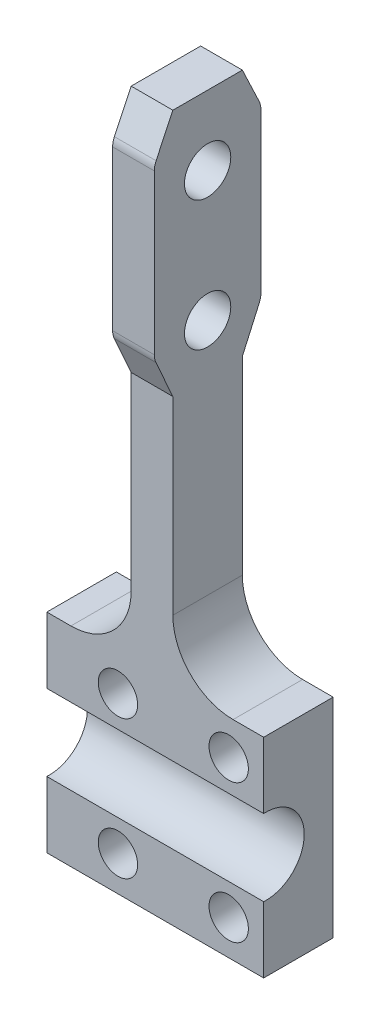
ISO-10303-21;
HEADER;
FILE_DESCRIPTION(('STEP AP214'),'2;1');
FILE_NAME('part.step','',(''),(''),'','','');
FILE_SCHEMA(('AUTOMOTIVE_DESIGN { 1 0 10303 214 1 1 1 1 }'));
ENDSEC;
DATA;
#1=APPLICATION_CONTEXT('core data for automotive mechanical design processes');
#2=APPLICATION_PROTOCOL_DEFINITION('international standard','automotive_design',2000,#1);
#3=PRODUCT_CONTEXT('',#1,'mechanical');
#4=PRODUCT('Part','Part','',(#3));
#5=PRODUCT_RELATED_PRODUCT_CATEGORY('part','',(#4));
#6=PRODUCT_DEFINITION_FORMATION('','',#4);
#7=PRODUCT_DEFINITION_CONTEXT('part definition',#1,'design');
#8=PRODUCT_DEFINITION('design','',#6,#7);
#9=PRODUCT_DEFINITION_SHAPE('','',#8);
#10=(LENGTH_UNIT() NAMED_UNIT(*) SI_UNIT(.MILLI.,.METRE.));
#11=(NAMED_UNIT(*) PLANE_ANGLE_UNIT() SI_UNIT($,.RADIAN.));
#12=(NAMED_UNIT(*) SI_UNIT($,.STERADIAN.) SOLID_ANGLE_UNIT());
#13=UNCERTAINTY_MEASURE_WITH_UNIT(LENGTH_MEASURE(1.E-05),#10,'distance_accuracy_value','');
#14=(GEOMETRIC_REPRESENTATION_CONTEXT(3) GLOBAL_UNCERTAINTY_ASSIGNED_CONTEXT((#13)) GLOBAL_UNIT_ASSIGNED_CONTEXT((#10,
#11,#12)) REPRESENTATION_CONTEXT('',''));
#15=CARTESIAN_POINT('',(0.,0.,0.));
#16=DIRECTION('',(0.,0.,1.));
#17=DIRECTION('',(1.,0.,0.));
#18=AXIS2_PLACEMENT_3D('',#15,#16,#17);
#19=CARTESIAN_POINT('',(13.9,35.5,0.));
#20=DIRECTION('',(0.,0.,1.));
#21=DIRECTION('',(1.,0.,0.));
#22=AXIS2_PLACEMENT_3D('',#19,#20,#21);
#23=PLANE('',#22);
#24=CARTESIAN_POINT('',(-10.95,14.95,0.));
#25=DIRECTION('',(0.,0.,1.));
#26=DIRECTION('',(1.,0.,0.));
#27=AXIS2_PLACEMENT_3D('',#24,#25,#26);
#28=CIRCLE('',#27,4.25);
#29=CARTESIAN_POINT('',(-6.7,14.95,0.));
#30=VERTEX_POINT('',#29);
#31=EDGE_CURVE('E276',#30,#30,#28,.T.);
#32=ORIENTED_EDGE('',*,*,#31,.T.);
#33=EDGE_LOOP('',(#32));
#34=FACE_BOUND('',#33,.T.);
#35=CARTESIAN_POINT('',(12.95,14.95,0.));
#36=DIRECTION('',(0.,0.,1.));
#37=DIRECTION('',(1.,0.,0.));
#38=AXIS2_PLACEMENT_3D('',#35,#36,#37);
#39=CIRCLE('',#38,4.25);
#40=CARTESIAN_POINT('',(17.2,14.95,0.));
#41=VERTEX_POINT('',#40);
#42=EDGE_CURVE('E280',#41,#41,#39,.T.);
#43=ORIENTED_EDGE('',*,*,#42,.T.);
#44=EDGE_LOOP('',(#43));
#45=FACE_BOUND('',#44,.T.);
#46=CARTESIAN_POINT('',(12.95,-14.95,0.));
#47=DIRECTION('',(0.,0.,1.));
#48=DIRECTION('',(1.,0.,0.));
#49=AXIS2_PLACEMENT_3D('',#46,#47,#48);
#50=CIRCLE('',#49,4.25);
#51=CARTESIAN_POINT('',(17.2,-14.95,0.));
#52=VERTEX_POINT('',#51);
#53=EDGE_CURVE('E286',#52,#52,#50,.T.);
#54=ORIENTED_EDGE('',*,*,#53,.T.);
#55=EDGE_LOOP('',(#54));
#56=FACE_BOUND('',#55,.T.);
#57=CARTESIAN_POINT('',(-10.95,-14.95,0.));
#58=DIRECTION('',(0.,0.,1.));
#59=DIRECTION('',(1.,0.,0.));
#60=AXIS2_PLACEMENT_3D('',#57,#58,#59);
#61=CIRCLE('',#60,4.25);
#62=CARTESIAN_POINT('',(-6.7,-14.95,0.));
#63=VERTEX_POINT('',#62);
#64=EDGE_CURVE('E292',#63,#63,#61,.T.);
#65=ORIENTED_EDGE('',*,*,#64,.T.);
#66=EDGE_LOOP('',(#65));
#67=FACE_BOUND('',#66,.T.);
#68=DIRECTION('',(-1.,0.,0.));
#69=VECTOR('',#68,1.);
#70=CARTESIAN_POINT('',(54.5624362774462,76.3868514547035,0.));
#71=LINE('',#70,#69);
#72=CARTESIAN_POINT('',(0.900000000000005,76.3868514547035,0.));
#73=VERTEX_POINT('',#72);
#74=CARTESIAN_POINT('',(-8.09999999999999,76.3868514547035,0.));
#75=VERTEX_POINT('',#74);
#76=EDGE_CURVE('E191',#73,#75,#71,.T.);
#77=ORIENTED_EDGE('',*,*,#76,.F.);
#78=DIRECTION('',(0.,1.,0.));
#79=VECTOR('',#78,1.);
#80=CARTESIAN_POINT('',(0.900000000000005,35.5000000000001,0.));
#81=LINE('',#80,#79);
#82=CARTESIAN_POINT('',(0.900000000000005,35.5000000000001,0.));
#83=VERTEX_POINT('',#82);
#84=EDGE_CURVE('E335',#83,#73,#81,.T.);
#85=ORIENTED_EDGE('',*,*,#84,.F.);
#86=CARTESIAN_POINT('',(13.9,35.5,0.));
#87=DIRECTION('',(0.,0.,-1.));
#88=DIRECTION('',(1.,0.,0.));
#89=AXIS2_PLACEMENT_3D('',#86,#87,#88);
#90=CIRCLE('',#89,13.);
#91=CARTESIAN_POINT('',(13.9000000000001,22.5,0.));
#92=VERTEX_POINT('',#91);
#93=EDGE_CURVE('E333',#92,#83,#90,.T.);
#94=ORIENTED_EDGE('',*,*,#93,.F.);
#95=DIRECTION('',(-1.,0.,0.));
#96=VECTOR('',#95,1.);
#97=CARTESIAN_POINT('',(20.5,22.5,0.));
#98=LINE('',#97,#96);
#99=CARTESIAN_POINT('',(20.5,22.5,0.));
#100=VERTEX_POINT('',#99);
#101=EDGE_CURVE('E331',#100,#92,#98,.T.);
#102=ORIENTED_EDGE('',*,*,#101,.F.);
#103=DIRECTION('',(0.,1.,0.));
#104=VECTOR('',#103,1.);
#105=CARTESIAN_POINT('',(20.5,-22.5,0.));
#106=LINE('',#105,#104);
#107=CARTESIAN_POINT('',(20.5,-22.5,0.));
#108=VERTEX_POINT('',#107);
#109=EDGE_CURVE('E329',#108,#100,#106,.T.);
#110=ORIENTED_EDGE('',*,*,#109,.F.);
#111=DIRECTION('',(1.,0.,0.));
#112=VECTOR('',#111,1.);
#113=CARTESIAN_POINT('',(-26.3,-22.5,0.));
#114=LINE('',#113,#112);
#115=CARTESIAN_POINT('',(-26.3,-22.5,0.));
#116=VERTEX_POINT('',#115);
#117=EDGE_CURVE('E298',#116,#108,#114,.T.);
#118=ORIENTED_EDGE('',*,*,#117,.F.);
#119=DIRECTION('',(0.,-1.,0.));
#120=VECTOR('',#119,1.);
#121=CARTESIAN_POINT('',(-26.3,22.5,0.));
#122=LINE('',#121,#120);
#123=CARTESIAN_POINT('',(-26.3,22.5,0.));
#124=VERTEX_POINT('',#123);
#125=EDGE_CURVE('E305',#124,#116,#122,.T.);
#126=ORIENTED_EDGE('',*,*,#125,.F.);
#127=DIRECTION('',(-1.,0.,0.));
#128=VECTOR('',#127,1.);
#129=CARTESIAN_POINT('',(-8.09999999999999,22.5,0.));
#130=LINE('',#129,#128);
#131=CARTESIAN_POINT('',(-21.1,22.5,0.));
#132=VERTEX_POINT('',#131);
#133=EDGE_CURVE('E342',#132,#124,#130,.T.);
#134=ORIENTED_EDGE('',*,*,#133,.F.);
#135=CARTESIAN_POINT('',(-21.1,35.5,0.));
#136=DIRECTION('',(0.,0.,1.));
#137=DIRECTION('',(1.,0.,0.));
#138=AXIS2_PLACEMENT_3D('',#135,#136,#137);
#139=CIRCLE('',#138,13.);
#140=CARTESIAN_POINT('',(-8.09999999999999,35.5,0.));
#141=VERTEX_POINT('',#140);
#142=EDGE_CURVE('E41',#132,#141,#139,.T.);
#143=ORIENTED_EDGE('',*,*,#142,.T.);
#144=DIRECTION('',(0.,-1.,0.));
#145=VECTOR('',#144,1.);
#146=CARTESIAN_POINT('',(-8.09999999999999,22.5,0.));
#147=LINE('',#146,#145);
#148=EDGE_CURVE('E340',#75,#141,#147,.T.);
#149=ORIENTED_EDGE('',*,*,#148,.F.);
#150=EDGE_LOOP('',(#77,#85,#94,#102,#110,#118,#126,#134,#143,#149));
#151=FACE_BOUND('',#150,.T.);
#152=ADVANCED_FACE('F33',(#34,#45,#56,#67,#151),#23,.F.);
#153=CARTESIAN_POINT('',(13.9,35.5,15.));
#154=DIRECTION('',(0.,0.,1.));
#155=DIRECTION('',(1.,0.,0.));
#156=AXIS2_PLACEMENT_3D('',#153,#154,#155);
#157=PLANE('',#156);
#158=DIRECTION('',(-1.,0.,0.));
#159=VECTOR('',#158,1.);
#160=CARTESIAN_POINT('',(54.5624362774462,76.3868514547035,15.));
#161=LINE('',#160,#159);
#162=CARTESIAN_POINT('',(0.900000000000005,76.3868514547035,15.));
#163=VERTEX_POINT('',#162);
#164=CARTESIAN_POINT('',(-8.09999999999999,76.3868514547035,15.));
#165=VERTEX_POINT('',#164);
#166=EDGE_CURVE('E247',#163,#165,#161,.T.);
#167=ORIENTED_EDGE('',*,*,#166,.T.);
#168=DIRECTION('',(0.,-1.,0.));
#169=VECTOR('',#168,1.);
#170=CARTESIAN_POINT('',(-8.09999999999999,22.5,15.));
#171=LINE('',#170,#169);
#172=CARTESIAN_POINT('',(-8.09999999999999,35.5,15.));
#173=VERTEX_POINT('',#172);
#174=EDGE_CURVE('E318',#165,#173,#171,.T.);
#175=ORIENTED_EDGE('',*,*,#174,.T.);
#176=CARTESIAN_POINT('',(-21.1,35.5,15.));
#177=DIRECTION('',(0.,0.,1.));
#178=DIRECTION('',(1.,0.,0.));
#179=AXIS2_PLACEMENT_3D('',#176,#177,#178);
#180=CIRCLE('',#179,13.);
#181=CARTESIAN_POINT('',(-21.1,22.5,15.));
#182=VERTEX_POINT('',#181);
#183=EDGE_CURVE('E11',#173,#182,#180,.F.);
#184=ORIENTED_EDGE('',*,*,#183,.T.);
#185=DIRECTION('',(-1.,0.,0.));
#186=VECTOR('',#185,1.);
#187=CARTESIAN_POINT('',(-8.09999999999999,22.5,15.));
#188=LINE('',#187,#186);
#189=CARTESIAN_POINT('',(-26.3,22.5,15.));
#190=VERTEX_POINT('',#189);
#191=EDGE_CURVE('E320',#182,#190,#188,.T.);
#192=ORIENTED_EDGE('',*,*,#191,.T.);
#193=DIRECTION('',(0.,-1.,0.));
#194=VECTOR('',#193,1.);
#195=CARTESIAN_POINT('',(-26.3,22.5,15.));
#196=LINE('',#195,#194);
#197=CARTESIAN_POINT('',(-26.3,8.2348345460003,15.));
#198=VERTEX_POINT('',#197);
#199=EDGE_CURVE('E323',#190,#198,#196,.T.);
#200=ORIENTED_EDGE('',*,*,#199,.T.);
#201=DIRECTION('',(-1.,0.,0.));
#202=VECTOR('',#201,1.);
#203=CARTESIAN_POINT('',(28.75,8.2348345460003,15.));
#204=LINE('',#203,#202);
#205=CARTESIAN_POINT('',(20.5,8.2348345460003,15.));
#206=VERTEX_POINT('',#205);
#207=EDGE_CURVE('E274',#206,#198,#204,.T.);
#208=ORIENTED_EDGE('',*,*,#207,.F.);
#209=DIRECTION('',(0.,1.,0.));
#210=VECTOR('',#209,1.);
#211=CARTESIAN_POINT('',(20.5,-22.5,15.));
#212=LINE('',#211,#210);
#213=CARTESIAN_POINT('',(20.5,22.5,15.));
#214=VERTEX_POINT('',#213);
#215=EDGE_CURVE('E304',#206,#214,#212,.T.);
#216=ORIENTED_EDGE('',*,*,#215,.T.);
#217=DIRECTION('',(-1.,0.,0.));
#218=VECTOR('',#217,1.);
#219=CARTESIAN_POINT('',(20.5,22.5,15.));
#220=LINE('',#219,#218);
#221=CARTESIAN_POINT('',(13.9000000000001,22.5,15.));
#222=VERTEX_POINT('',#221);
#223=EDGE_CURVE('E309',#214,#222,#220,.T.);
#224=ORIENTED_EDGE('',*,*,#223,.T.);
#225=CARTESIAN_POINT('',(13.9,35.5,15.));
#226=DIRECTION('',(0.,0.,-1.));
#227=DIRECTION('',(1.,0.,0.));
#228=AXIS2_PLACEMENT_3D('',#225,#226,#227);
#229=CIRCLE('',#228,13.);
#230=CARTESIAN_POINT('',(0.900000000000005,35.5000000000001,15.));
#231=VERTEX_POINT('',#230);
#232=EDGE_CURVE('E311',#222,#231,#229,.T.);
#233=ORIENTED_EDGE('',*,*,#232,.T.);
#234=DIRECTION('',(0.,1.,0.));
#235=VECTOR('',#234,1.);
#236=CARTESIAN_POINT('',(0.900000000000005,35.5000000000001,15.));
#237=LINE('',#236,#235);
#238=EDGE_CURVE('E313',#231,#163,#237,.T.);
#239=ORIENTED_EDGE('',*,*,#238,.T.);
#240=EDGE_LOOP('',(#167,#175,#184,#192,#200,#208,#216,#224,#233,#239));
#241=FACE_BOUND('',#240,.T.);
#242=CARTESIAN_POINT('',(-10.95,14.95,15.));
#243=DIRECTION('',(0.,0.,1.));
#244=DIRECTION('',(1.,0.,0.));
#245=AXIS2_PLACEMENT_3D('',#242,#243,#244);
#246=CIRCLE('',#245,4.25);
#247=CARTESIAN_POINT('',(-6.7,14.95,15.));
#248=VERTEX_POINT('',#247);
#249=EDGE_CURVE('E277',#248,#248,#246,.T.);
#250=ORIENTED_EDGE('',*,*,#249,.F.);
#251=EDGE_LOOP('',(#250));
#252=FACE_BOUND('',#251,.T.);
#253=CARTESIAN_POINT('',(12.95,14.95,15.));
#254=DIRECTION('',(0.,0.,1.));
#255=DIRECTION('',(1.,0.,0.));
#256=AXIS2_PLACEMENT_3D('',#253,#254,#255);
#257=CIRCLE('',#256,4.25);
#258=CARTESIAN_POINT('',(17.2,14.95,15.));
#259=VERTEX_POINT('',#258);
#260=EDGE_CURVE('E283',#259,#259,#257,.T.);
#261=ORIENTED_EDGE('',*,*,#260,.F.);
#262=EDGE_LOOP('',(#261));
#263=FACE_BOUND('',#262,.T.);
#264=ADVANCED_FACE('F400',(#241,#252,#263),#157,.T.);
#265=DIRECTION('',(-1.,0.,0.));
#266=VECTOR('',#265,1.);
#267=CARTESIAN_POINT('',(28.75,-8.2348345460003,15.));
#268=LINE('',#267,#266);
#269=CARTESIAN_POINT('',(-26.3,-8.2348345460003,15.));
#270=VERTEX_POINT('',#269);
#271=CARTESIAN_POINT('',(20.5,-8.2348345460003,15.));
#272=VERTEX_POINT('',#271);
#273=EDGE_CURVE('E272',#270,#272,#268,.F.);
#274=ORIENTED_EDGE('',*,*,#273,.F.);
#275=CARTESIAN_POINT('',(-26.3,-22.5,15.));
#276=VERTEX_POINT('',#275);
#277=EDGE_CURVE('E322',#270,#276,#196,.T.);
#278=ORIENTED_EDGE('',*,*,#277,.T.);
#279=DIRECTION('',(1.,0.,0.));
#280=VECTOR('',#279,1.);
#281=CARTESIAN_POINT('',(-26.3,-22.5,15.));
#282=LINE('',#281,#280);
#283=CARTESIAN_POINT('',(20.5,-22.5,15.));
#284=VERTEX_POINT('',#283);
#285=EDGE_CURVE('E301',#276,#284,#282,.T.);
#286=ORIENTED_EDGE('',*,*,#285,.T.);
#287=EDGE_CURVE('E306',#284,#272,#212,.T.);
#288=ORIENTED_EDGE('',*,*,#287,.T.);
#289=EDGE_LOOP('',(#274,#278,#286,#288));
#290=FACE_BOUND('',#289,.T.);
#291=CARTESIAN_POINT('',(-10.95,-14.95,15.));
#292=DIRECTION('',(0.,0.,1.));
#293=DIRECTION('',(1.,0.,0.));
#294=AXIS2_PLACEMENT_3D('',#291,#292,#293);
#295=CIRCLE('',#294,4.25);
#296=CARTESIAN_POINT('',(-6.7,-14.95,15.));
#297=VERTEX_POINT('',#296);
#298=EDGE_CURVE('E295',#297,#297,#295,.T.);
#299=ORIENTED_EDGE('',*,*,#298,.F.);
#300=EDGE_LOOP('',(#299));
#301=FACE_BOUND('',#300,.T.);
#302=CARTESIAN_POINT('',(12.95,-14.95,15.));
#303=DIRECTION('',(0.,0.,1.));
#304=DIRECTION('',(1.,0.,0.));
#305=AXIS2_PLACEMENT_3D('',#302,#303,#304);
#306=CIRCLE('',#305,4.25);
#307=CARTESIAN_POINT('',(17.2,-14.95,15.));
#308=VERTEX_POINT('',#307);
#309=EDGE_CURVE('E289',#308,#308,#306,.T.);
#310=ORIENTED_EDGE('',*,*,#309,.F.);
#311=EDGE_LOOP('',(#310));
#312=FACE_BOUND('',#311,.T.);
#313=ADVANCED_FACE('F394',(#290,#301,#312),#157,.T.);
#314=CARTESIAN_POINT('',(-26.3,-22.5,15.));
#315=DIRECTION('',(0.,1.,0.));
#316=DIRECTION('',(0.,0.,1.));
#317=AXIS2_PLACEMENT_3D('',#314,#315,#316);
#318=PLANE('',#317);
#319=ORIENTED_EDGE('',*,*,#117,.T.);
#320=DIRECTION('',(0.,0.,-1.));
#321=VECTOR('',#320,1.);
#322=CARTESIAN_POINT('',(20.5,-22.5,15.));
#323=LINE('',#322,#321);
#324=EDGE_CURVE('E364',#284,#108,#323,.T.);
#325=ORIENTED_EDGE('',*,*,#324,.F.);
#326=ORIENTED_EDGE('',*,*,#285,.F.);
#327=DIRECTION('',(0.,0.,-1.));
#328=VECTOR('',#327,1.);
#329=CARTESIAN_POINT('',(-26.3,-22.5,15.));
#330=LINE('',#329,#328);
#331=EDGE_CURVE('E326',#276,#116,#330,.T.);
#332=ORIENTED_EDGE('',*,*,#331,.T.);
#333=EDGE_LOOP('',(#319,#325,#326,#332));
#334=FACE_BOUND('',#333,.T.);
#335=ADVANCED_FACE('F390',(#334),#318,.F.);
#336=CARTESIAN_POINT('',(20.5,-22.5,15.));
#337=DIRECTION('',(-1.,0.,0.));
#338=DIRECTION('',(0.,-1.,0.));
#339=AXIS2_PLACEMENT_3D('',#336,#337,#338);
#340=PLANE('',#339);
#341=ORIENTED_EDGE('',*,*,#215,.F.);
#342=CARTESIAN_POINT('',(20.5,0.,14.5));
#343=DIRECTION('',(-1.,0.,0.));
#344=DIRECTION('',(0.,-1.,0.));
#345=AXIS2_PLACEMENT_3D('',#342,#343,#344);
#346=CIRCLE('',#345,8.25);
#347=EDGE_CURVE('E268',#206,#272,#346,.T.);
#348=ORIENTED_EDGE('',*,*,#347,.T.);
#349=ORIENTED_EDGE('',*,*,#287,.F.);
#350=ORIENTED_EDGE('',*,*,#324,.T.);
#351=ORIENTED_EDGE('',*,*,#109,.T.);
#352=DIRECTION('',(0.,0.,-1.));
#353=VECTOR('',#352,1.);
#354=CARTESIAN_POINT('',(20.5,22.5,15.));
#355=LINE('',#354,#353);
#356=EDGE_CURVE('E361',#214,#100,#355,.T.);
#357=ORIENTED_EDGE('',*,*,#356,.F.);
#358=EDGE_LOOP('',(#341,#348,#349,#350,#351,#357));
#359=FACE_BOUND('',#358,.T.);
#360=ADVANCED_FACE('F442',(#359),#340,.F.);
#361=CARTESIAN_POINT('',(20.5,22.5,15.));
#362=DIRECTION('',(0.,-1.,0.));
#363=DIRECTION('',(0.,0.,-1.));
#364=AXIS2_PLACEMENT_3D('',#361,#362,#363);
#365=PLANE('',#364);
#366=ORIENTED_EDGE('',*,*,#101,.T.);
#367=DIRECTION('',(0.,0.,-1.));
#368=VECTOR('',#367,1.);
#369=CARTESIAN_POINT('',(13.9000000000001,22.5,15.));
#370=LINE('',#369,#368);
#371=EDGE_CURVE('E358',#222,#92,#370,.T.);
#372=ORIENTED_EDGE('',*,*,#371,.F.);
#373=ORIENTED_EDGE('',*,*,#223,.F.);
#374=ORIENTED_EDGE('',*,*,#356,.T.);
#375=EDGE_LOOP('',(#366,#372,#373,#374));
#376=FACE_BOUND('',#375,.T.);
#377=ADVANCED_FACE('F438',(#376),#365,.F.);
#378=CARTESIAN_POINT('',(13.9,35.5,15.));
#379=DIRECTION('',(0.,0.,-1.));
#380=DIRECTION('',(-1.,0.,0.));
#381=AXIS2_PLACEMENT_3D('',#378,#379,#380);
#382=CYLINDRICAL_SURFACE('',#381,13.);
#383=ORIENTED_EDGE('',*,*,#93,.T.);
#384=DIRECTION('',(0.,0.,-1.));
#385=VECTOR('',#384,1.);
#386=CARTESIAN_POINT('',(0.900000000000005,35.5000000000001,15.));
#387=LINE('',#386,#385);
#388=EDGE_CURVE('E355',#231,#83,#387,.T.);
#389=ORIENTED_EDGE('',*,*,#388,.F.);
#390=ORIENTED_EDGE('',*,*,#232,.F.);
#391=ORIENTED_EDGE('',*,*,#371,.T.);
#392=EDGE_LOOP('',(#383,#389,#390,#391));
#393=FACE_BOUND('',#392,.T.);
#394=ADVANCED_FACE('F434',(#393),#382,.F.);
#395=CARTESIAN_POINT('',(0.900000000000005,35.5000000000001,15.));
#396=DIRECTION('',(-1.,0.,0.));
#397=DIRECTION('',(0.,0.,1.));
#398=AXIS2_PLACEMENT_3D('',#395,#396,#397);
#399=PLANE('',#398);
#400=CARTESIAN_POINT('',(0.900000000000005,86.9,7.5));
#401=DIRECTION('',(1.,0.,0.));
#402=DIRECTION('',(0.,0.,-1.));
#403=AXIS2_PLACEMENT_3D('',#400,#401,#402);
#404=CIRCLE('',#403,5.);
#405=CARTESIAN_POINT('',(0.900000000000005,86.9,2.5));
#406=VERTEX_POINT('',#405);
#407=EDGE_CURVE('E260',#406,#406,#404,.T.);
#408=ORIENTED_EDGE('',*,*,#407,.F.);
#409=EDGE_LOOP('',(#408));
#410=FACE_BOUND('',#409,.T.);
#411=CARTESIAN_POINT('',(0.900000000000005,114.9,7.5));
#412=DIRECTION('',(1.,0.,0.));
#413=DIRECTION('',(0.,0.,-1.));
#414=AXIS2_PLACEMENT_3D('',#411,#412,#413);
#415=CIRCLE('',#414,5.);
#416=CARTESIAN_POINT('',(0.900000000000005,114.9,2.5));
#417=VERTEX_POINT('',#416);
#418=EDGE_CURVE('E259',#417,#417,#415,.T.);
#419=ORIENTED_EDGE('',*,*,#418,.F.);
#420=EDGE_LOOP('',(#419));
#421=FACE_BOUND('',#420,.T.);
#422=ORIENTED_EDGE('',*,*,#84,.T.);
#423=DIRECTION('',(0.,0.912907574661992,-0.40816633879432));
#424=VECTOR('',#423,1.);
#425=CARTESIAN_POINT('',(0.900000000000005,76.3868514547035,0.));
#426=LINE('',#425,#424);
#427=CARTESIAN_POINT('',(0.900000000000005,84.5541123056302,-3.65163029864797));
#428=VERTEX_POINT('',#427);
#429=EDGE_CURVE('E220',#73,#428,#426,.T.);
#430=ORIENTED_EDGE('',*,*,#429,.T.);
#431=CARTESIAN_POINT('',(0.900000000000005,86.1867776608075,0.));
#432=DIRECTION('',(-1.,0.,0.));
#433=DIRECTION('',(0.,0.,1.));
#434=AXIS2_PLACEMENT_3D('',#431,#432,#433);
#435=CIRCLE('',#434,4.);
#436=CARTESIAN_POINT('',(0.900000000000005,86.1867776608075,-3.99999999999999));
#437=VERTEX_POINT('',#436);
#438=EDGE_CURVE('E188',#428,#437,#435,.F.);
#439=ORIENTED_EDGE('',*,*,#438,.T.);
#440=DIRECTION('',(0.,1.,0.));
#441=VECTOR('',#440,1.);
#442=CARTESIAN_POINT('',(0.900000000000005,86.1867776608075,-3.99999999999999));
#443=LINE('',#442,#441);
#444=CARTESIAN_POINT('',(0.900000000000005,120.550049195899,-4.));
#445=VERTEX_POINT('',#444);
#446=EDGE_CURVE('E732',#437,#445,#443,.T.);
#447=ORIENTED_EDGE('',*,*,#446,.T.);
#448=CARTESIAN_POINT('',(0.900000000000005,120.550049195899,0.));
#449=DIRECTION('',(-1.,0.,0.));
#450=DIRECTION('',(0.,0.,1.));
#451=AXIS2_PLACEMENT_3D('',#448,#449,#450);
#452=CIRCLE('',#451,4.);
#453=CARTESIAN_POINT('',(0.900000000000005,122.261288146267,-3.61547524604226));
#454=VERTEX_POINT('',#453);
#455=EDGE_CURVE('E733',#445,#454,#452,.F.);
#456=ORIENTED_EDGE('',*,*,#455,.T.);
#457=DIRECTION('',(0.,0.903868811510564,0.427809737591936));
#458=VECTOR('',#457,1.);
#459=CARTESIAN_POINT('',(0.900000000000005,122.261288146267,-3.61547524604226));
#460=LINE('',#459,#458);
#461=CARTESIAN_POINT('',(0.900000000000005,129.9,0.));
#462=VERTEX_POINT('',#461);
#463=EDGE_CURVE('E214',#454,#462,#460,.T.);
#464=ORIENTED_EDGE('',*,*,#463,.T.);
#465=DIRECTION('',(0.,0.,-1.));
#466=VECTOR('',#465,1.);
#467=CARTESIAN_POINT('',(0.900000000000005,129.9,15.));
#468=LINE('',#467,#466);
#469=CARTESIAN_POINT('',(0.900000000000005,129.9,15.));
#470=VERTEX_POINT('',#469);
#471=EDGE_CURVE('E353',#470,#462,#468,.T.);
#472=ORIENTED_EDGE('',*,*,#471,.F.);
#473=DIRECTION('',(0.,-0.903868811510564,0.427809737591936));
#474=VECTOR('',#473,1.);
#475=CARTESIAN_POINT('',(0.900000000000005,122.261288146267,18.6154752460423));
#476=LINE('',#475,#474);
#477=CARTESIAN_POINT('',(0.900000000000005,122.261288146267,18.6154752460423));
#478=VERTEX_POINT('',#477);
#479=EDGE_CURVE('E230',#470,#478,#476,.T.);
#480=ORIENTED_EDGE('',*,*,#479,.T.);
#481=CARTESIAN_POINT('',(0.900000000000005,120.550049195899,15.));
#482=DIRECTION('',(-1.,0.,0.));
#483=DIRECTION('',(0.,0.,1.));
#484=AXIS2_PLACEMENT_3D('',#481,#482,#483);
#485=CIRCLE('',#484,4.);
#486=CARTESIAN_POINT('',(0.900000000000005,120.550049195899,19.));
#487=VERTEX_POINT('',#486);
#488=EDGE_CURVE('E228',#478,#487,#485,.F.);
#489=ORIENTED_EDGE('',*,*,#488,.T.);
#490=DIRECTION('',(0.,-1.,0.));
#491=VECTOR('',#490,1.);
#492=CARTESIAN_POINT('',(0.900000000000005,86.1867776608075,19.));
#493=LINE('',#492,#491);
#494=CARTESIAN_POINT('',(0.900000000000005,86.1867776608075,19.));
#495=VERTEX_POINT('',#494);
#496=EDGE_CURVE('E225',#487,#495,#493,.T.);
#497=ORIENTED_EDGE('',*,*,#496,.T.);
#498=CARTESIAN_POINT('',(0.900000000000005,86.1867776608075,15.));
#499=DIRECTION('',(-1.,0.,0.));
#500=DIRECTION('',(0.,0.,1.));
#501=AXIS2_PLACEMENT_3D('',#498,#499,#500);
#502=CIRCLE('',#501,4.);
#503=CARTESIAN_POINT('',(0.900000000000005,84.5541123056302,18.651630298648));
#504=VERTEX_POINT('',#503);
#505=EDGE_CURVE('E223',#495,#504,#502,.F.);
#506=ORIENTED_EDGE('',*,*,#505,.T.);
#507=DIRECTION('',(0.,-0.912907574661992,-0.408166338794321));
#508=VECTOR('',#507,1.);
#509=CARTESIAN_POINT('',(0.900000000000005,76.3868514547035,15.));
#510=LINE('',#509,#508);
#511=EDGE_CURVE('E232',#504,#163,#510,.T.);
#512=ORIENTED_EDGE('',*,*,#511,.T.);
#513=ORIENTED_EDGE('',*,*,#238,.F.);
#514=ORIENTED_EDGE('',*,*,#388,.T.);
#515=EDGE_LOOP('',(#422,#430,#439,#447,#456,#464,#472,#480,#489,#497,#506,#512,#513,#514));
#516=FACE_BOUND('',#515,.T.);
#517=ADVANCED_FACE('F430',(#410,#421,#516),#399,.F.);
#518=CARTESIAN_POINT('',(-8.09999999999999,129.9,15.));
#519=DIRECTION('',(0.,-1.,0.));
#520=DIRECTION('',(0.,0.,-1.));
#521=AXIS2_PLACEMENT_3D('',#518,#519,#520);
#522=PLANE('',#521);
#523=DIRECTION('',(-1.,0.,0.));
#524=VECTOR('',#523,1.);
#525=CARTESIAN_POINT('',(-8.09999999999999,129.9,0.));
#526=LINE('',#525,#524);
#527=CARTESIAN_POINT('',(-8.09999999999999,129.9,0.));
#528=VERTEX_POINT('',#527);
#529=EDGE_CURVE('E338',#462,#528,#526,.T.);
#530=ORIENTED_EDGE('',*,*,#529,.T.);
#531=DIRECTION('',(0.,0.,-1.));
#532=VECTOR('',#531,1.);
#533=CARTESIAN_POINT('',(-8.09999999999999,129.9,15.));
#534=LINE('',#533,#532);
#535=CARTESIAN_POINT('',(-8.09999999999999,129.9,15.));
#536=VERTEX_POINT('',#535);
#537=EDGE_CURVE('E350',#536,#528,#534,.T.);
#538=ORIENTED_EDGE('',*,*,#537,.F.);
#539=DIRECTION('',(-1.,0.,0.));
#540=VECTOR('',#539,1.);
#541=CARTESIAN_POINT('',(-8.09999999999999,129.9,15.));
#542=LINE('',#541,#540);
#543=EDGE_CURVE('E315',#470,#536,#542,.T.);
#544=ORIENTED_EDGE('',*,*,#543,.F.);
#545=ORIENTED_EDGE('',*,*,#471,.T.);
#546=EDGE_LOOP('',(#530,#538,#544,#545));
#547=FACE_BOUND('',#546,.T.);
#548=ADVANCED_FACE('F426',(#547),#522,.F.);
#549=CARTESIAN_POINT('',(-8.09999999999999,22.5,15.));
#550=DIRECTION('',(1.,0.,0.));
#551=DIRECTION('',(0.,0.,-1.));
#552=AXIS2_PLACEMENT_3D('',#549,#550,#551);
#553=PLANE('',#552);
#554=CARTESIAN_POINT('',(-8.1,86.9,7.5));
#555=DIRECTION('',(1.,0.,0.));
#556=DIRECTION('',(0.,0.,-1.));
#557=AXIS2_PLACEMENT_3D('',#554,#555,#556);
#558=CIRCLE('',#557,5.);
#559=CARTESIAN_POINT('',(-8.1,86.9,2.5));
#560=VERTEX_POINT('',#559);
#561=EDGE_CURVE('E269',#560,#560,#558,.T.);
#562=ORIENTED_EDGE('',*,*,#561,.T.);
#563=EDGE_LOOP('',(#562));
#564=FACE_BOUND('',#563,.T.);
#565=CARTESIAN_POINT('',(-8.1,114.9,7.5));
#566=DIRECTION('',(1.,0.,0.));
#567=DIRECTION('',(0.,0.,-1.));
#568=AXIS2_PLACEMENT_3D('',#565,#566,#567);
#569=CIRCLE('',#568,5.);
#570=CARTESIAN_POINT('',(-8.1,114.9,2.5));
#571=VERTEX_POINT('',#570);
#572=EDGE_CURVE('E263',#571,#571,#569,.T.);
#573=ORIENTED_EDGE('',*,*,#572,.T.);
#574=EDGE_LOOP('',(#573));
#575=FACE_BOUND('',#574,.T.);
#576=ORIENTED_EDGE('',*,*,#148,.T.);
#577=DIRECTION('',(0.,0.,-1.));
#578=VECTOR('',#577,1.);
#579=CARTESIAN_POINT('',(-8.09999999999999,35.5,15.));
#580=LINE('',#579,#578);
#581=EDGE_CURVE('E48',#141,#173,#580,.F.);
#582=ORIENTED_EDGE('',*,*,#581,.T.);
#583=ORIENTED_EDGE('',*,*,#174,.F.);
#584=DIRECTION('',(0.,0.912907574661992,0.408166338794321));
#585=VECTOR('',#584,1.);
#586=CARTESIAN_POINT('',(-8.09999999999999,76.3868514547035,15.));
#587=LINE('',#586,#585);
#588=CARTESIAN_POINT('',(-8.09999999999999,84.5541123056302,18.651630298648));
#589=VERTEX_POINT('',#588);
#590=EDGE_CURVE('E222',#165,#589,#587,.T.);
#591=ORIENTED_EDGE('',*,*,#590,.T.);
#592=CARTESIAN_POINT('',(-8.09999999999999,86.1867776608075,15.));
#593=DIRECTION('',(-1.,0.,0.));
#594=DIRECTION('',(0.,0.,1.));
#595=AXIS2_PLACEMENT_3D('',#592,#593,#594);
#596=CIRCLE('',#595,4.);
#597=CARTESIAN_POINT('',(-8.09999999999999,86.1867776608075,19.));
#598=VERTEX_POINT('',#597);
#599=EDGE_CURVE('E235',#589,#598,#596,.T.);
#600=ORIENTED_EDGE('',*,*,#599,.T.);
#601=DIRECTION('',(0.,1.,0.));
#602=VECTOR('',#601,1.);
#603=CARTESIAN_POINT('',(-8.09999999999999,86.1867776608075,19.));
#604=LINE('',#603,#602);
#605=CARTESIAN_POINT('',(-8.09999999999999,120.550049195899,19.));
#606=VERTEX_POINT('',#605);
#607=EDGE_CURVE('E238',#598,#606,#604,.T.);
#608=ORIENTED_EDGE('',*,*,#607,.T.);
#609=CARTESIAN_POINT('',(-8.09999999999999,120.550049195899,15.));
#610=DIRECTION('',(-1.,0.,0.));
#611=DIRECTION('',(0.,0.,1.));
#612=AXIS2_PLACEMENT_3D('',#609,#610,#611);
#613=CIRCLE('',#612,4.);
#614=CARTESIAN_POINT('',(-8.09999999999999,122.261288146267,18.6154752460423));
#615=VERTEX_POINT('',#614);
#616=EDGE_CURVE('E241',#606,#615,#613,.T.);
#617=ORIENTED_EDGE('',*,*,#616,.T.);
#618=DIRECTION('',(0.,0.903868811510564,-0.427809737591936));
#619=VECTOR('',#618,1.);
#620=CARTESIAN_POINT('',(-8.09999999999999,122.261288146267,18.6154752460423));
#621=LINE('',#620,#619);
#622=EDGE_CURVE('E244',#615,#536,#621,.T.);
#623=ORIENTED_EDGE('',*,*,#622,.T.);
#624=ORIENTED_EDGE('',*,*,#537,.T.);
#625=DIRECTION('',(0.,-0.903868811510564,-0.427809737591936));
#626=VECTOR('',#625,1.);
#627=CARTESIAN_POINT('',(-8.09999999999999,122.261288146267,-3.61547524604226));
#628=LINE('',#627,#626);
#629=CARTESIAN_POINT('',(-8.09999999999999,122.261288146267,-3.61547524604226));
#630=VERTEX_POINT('',#629);
#631=EDGE_CURVE('E198',#528,#630,#628,.T.);
#632=ORIENTED_EDGE('',*,*,#631,.T.);
#633=CARTESIAN_POINT('',(-8.09999999999999,120.550049195899,0.));
#634=DIRECTION('',(-1.,0.,0.));
#635=DIRECTION('',(0.,0.,-1.));
#636=AXIS2_PLACEMENT_3D('',#633,#634,#635);
#637=CIRCLE('',#636,4.);
#638=CARTESIAN_POINT('',(-8.09999999999999,120.550049195899,-4.));
#639=VERTEX_POINT('',#638);
#640=EDGE_CURVE('E209',#630,#639,#637,.T.);
#641=ORIENTED_EDGE('',*,*,#640,.T.);
#642=DIRECTION('',(0.,-1.,0.));
#643=VECTOR('',#642,1.);
#644=CARTESIAN_POINT('',(-8.09999999999999,86.1867776608075,-3.99999999999999));
#645=LINE('',#644,#643);
#646=CARTESIAN_POINT('',(-8.09999999999999,86.1867776608075,-3.99999999999999));
#647=VERTEX_POINT('',#646);
#648=EDGE_CURVE('E192',#639,#647,#645,.T.);
#649=ORIENTED_EDGE('',*,*,#648,.T.);
#650=CARTESIAN_POINT('',(-8.09999999999999,86.1867776608075,0.));
#651=DIRECTION('',(-1.,0.,0.));
#652=DIRECTION('',(0.,0.,-1.));
#653=AXIS2_PLACEMENT_3D('',#650,#651,#652);
#654=CIRCLE('',#653,4.);
#655=CARTESIAN_POINT('',(-8.09999999999999,84.5541123056302,-3.65163029864797));
#656=VERTEX_POINT('',#655);
#657=EDGE_CURVE('E186',#647,#656,#654,.T.);
#658=ORIENTED_EDGE('',*,*,#657,.T.);
#659=DIRECTION('',(0.,-0.912907574661992,0.40816633879432));
#660=VECTOR('',#659,1.);
#661=CARTESIAN_POINT('',(-8.09999999999999,76.3868514547035,0.));
#662=LINE('',#661,#660);
#663=EDGE_CURVE('E196',#656,#75,#662,.T.);
#664=ORIENTED_EDGE('',*,*,#663,.T.);
#665=EDGE_LOOP('',(#576,#582,#583,#591,#600,#608,#617,#623,#624,#632,#641,#649,#658,#664));
#666=FACE_BOUND('',#665,.T.);
#667=ADVANCED_FACE('F200',(#564,#575,#666),#553,.F.);
#668=CARTESIAN_POINT('',(-8.09999999999999,22.5,15.));
#669=DIRECTION('',(0.,-1.,0.));
#670=DIRECTION('',(0.,0.,-1.));
#671=AXIS2_PLACEMENT_3D('',#668,#669,#670);
#672=PLANE('',#671);
#673=ORIENTED_EDGE('',*,*,#191,.F.);
#674=DIRECTION('',(0.,0.,-1.));
#675=VECTOR('',#674,1.);
#676=CARTESIAN_POINT('',(-21.1,22.5,0.));
#677=LINE('',#676,#675);
#678=EDGE_CURVE('E367',#182,#132,#677,.T.);
#679=ORIENTED_EDGE('',*,*,#678,.T.);
#680=ORIENTED_EDGE('',*,*,#133,.T.);
#681=DIRECTION('',(0.,0.,-1.));
#682=VECTOR('',#681,1.);
#683=CARTESIAN_POINT('',(-26.3,22.5,15.));
#684=LINE('',#683,#682);
#685=EDGE_CURVE('E347',#190,#124,#684,.T.);
#686=ORIENTED_EDGE('',*,*,#685,.F.);
#687=EDGE_LOOP('',(#673,#679,#680,#686));
#688=FACE_BOUND('',#687,.T.);
#689=ADVANCED_FACE('F377',(#688),#672,.F.);
#690=CARTESIAN_POINT('',(-26.3,22.5,15.));
#691=DIRECTION('',(1.,0.,0.));
#692=DIRECTION('',(0.,0.,-1.));
#693=AXIS2_PLACEMENT_3D('',#690,#691,#692);
#694=PLANE('',#693);
#695=ORIENTED_EDGE('',*,*,#277,.F.);
#696=CARTESIAN_POINT('',(-26.3,0.,14.5));
#697=DIRECTION('',(-1.,0.,0.));
#698=DIRECTION('',(0.,0.,1.));
#699=AXIS2_PLACEMENT_3D('',#696,#697,#698);
#700=CIRCLE('',#699,8.25);
#701=EDGE_CURVE('E266',#198,#270,#700,.T.);
#702=ORIENTED_EDGE('',*,*,#701,.F.);
#703=ORIENTED_EDGE('',*,*,#199,.F.);
#704=ORIENTED_EDGE('',*,*,#685,.T.);
#705=ORIENTED_EDGE('',*,*,#125,.T.);
#706=ORIENTED_EDGE('',*,*,#331,.F.);
#707=EDGE_LOOP('',(#695,#702,#703,#704,#705,#706));
#708=FACE_BOUND('',#707,.T.);
#709=ADVANCED_FACE('F386',(#708),#694,.F.);
#710=CARTESIAN_POINT('',(-10.95,-14.95,15.));
#711=DIRECTION('',(0.,0.,-1.));
#712=DIRECTION('',(-1.,0.,0.));
#713=AXIS2_PLACEMENT_3D('',#710,#711,#712);
#714=CYLINDRICAL_SURFACE('',#713,4.25);
#715=ORIENTED_EDGE('',*,*,#298,.T.);
#716=EDGE_LOOP('',(#715));
#717=FACE_BOUND('',#716,.T.);
#718=ORIENTED_EDGE('',*,*,#64,.F.);
#719=EDGE_LOOP('',(#718));
#720=FACE_BOUND('',#719,.T.);
#721=ADVANCED_FACE('F421',(#717,#720),#714,.F.);
#722=CARTESIAN_POINT('',(12.95,-14.95,15.));
#723=DIRECTION('',(0.,0.,-1.));
#724=DIRECTION('',(-1.,0.,0.));
#725=AXIS2_PLACEMENT_3D('',#722,#723,#724);
#726=CYLINDRICAL_SURFACE('',#725,4.25);
#727=ORIENTED_EDGE('',*,*,#309,.T.);
#728=EDGE_LOOP('',(#727));
#729=FACE_BOUND('',#728,.T.);
#730=ORIENTED_EDGE('',*,*,#53,.F.);
#731=EDGE_LOOP('',(#730));
#732=FACE_BOUND('',#731,.T.);
#733=ADVANCED_FACE('F639',(#729,#732),#726,.F.);
#734=CARTESIAN_POINT('',(12.95,14.95,15.));
#735=DIRECTION('',(0.,0.,-1.));
#736=DIRECTION('',(-1.,0.,0.));
#737=AXIS2_PLACEMENT_3D('',#734,#735,#736);
#738=CYLINDRICAL_SURFACE('',#737,4.25);
#739=ORIENTED_EDGE('',*,*,#260,.T.);
#740=EDGE_LOOP('',(#739));
#741=FACE_BOUND('',#740,.T.);
#742=ORIENTED_EDGE('',*,*,#42,.F.);
#743=EDGE_LOOP('',(#742));
#744=FACE_BOUND('',#743,.T.);
#745=ADVANCED_FACE('F648',(#741,#744),#738,.F.);
#746=CARTESIAN_POINT('',(-10.95,14.95,15.));
#747=DIRECTION('',(0.,0.,-1.));
#748=DIRECTION('',(-1.,0.,0.));
#749=AXIS2_PLACEMENT_3D('',#746,#747,#748);
#750=CYLINDRICAL_SURFACE('',#749,4.25);
#751=ORIENTED_EDGE('',*,*,#249,.T.);
#752=EDGE_LOOP('',(#751));
#753=FACE_BOUND('',#752,.T.);
#754=ORIENTED_EDGE('',*,*,#31,.F.);
#755=EDGE_LOOP('',(#754));
#756=FACE_BOUND('',#755,.T.);
#757=ADVANCED_FACE('F608',(#753,#756),#750,.F.);
#758=CARTESIAN_POINT('',(28.75,0.,14.5));
#759=DIRECTION('',(-1.,0.,0.));
#760=DIRECTION('',(0.,0.,1.));
#761=AXIS2_PLACEMENT_3D('',#758,#759,#760);
#762=CYLINDRICAL_SURFACE('',#761,8.25);
#763=ORIENTED_EDGE('',*,*,#207,.T.);
#764=ORIENTED_EDGE('',*,*,#701,.T.);
#765=ORIENTED_EDGE('',*,*,#273,.T.);
#766=ORIENTED_EDGE('',*,*,#347,.F.);
#767=EDGE_LOOP('',(#763,#764,#765,#766));
#768=FACE_BOUND('',#767,.T.);
#769=ADVANCED_FACE('F599',(#768),#762,.F.);
#770=CARTESIAN_POINT('',(-45.15,114.9,7.5));
#771=DIRECTION('',(1.,0.,0.));
#772=DIRECTION('',(0.,0.,-1.));
#773=AXIS2_PLACEMENT_3D('',#770,#771,#772);
#774=CYLINDRICAL_SURFACE('',#773,5.);
#775=ORIENTED_EDGE('',*,*,#418,.T.);
#776=EDGE_LOOP('',(#775));
#777=FACE_BOUND('',#776,.T.);
#778=ORIENTED_EDGE('',*,*,#572,.F.);
#779=EDGE_LOOP('',(#778));
#780=FACE_BOUND('',#779,.T.);
#781=ADVANCED_FACE('F589',(#777,#780),#774,.F.);
#782=CARTESIAN_POINT('',(-45.15,86.9,7.5));
#783=DIRECTION('',(1.,0.,0.));
#784=DIRECTION('',(0.,0.,-1.));
#785=AXIS2_PLACEMENT_3D('',#782,#783,#784);
#786=CYLINDRICAL_SURFACE('',#785,5.);
#787=ORIENTED_EDGE('',*,*,#407,.T.);
#788=EDGE_LOOP('',(#787));
#789=FACE_BOUND('',#788,.T.);
#790=ORIENTED_EDGE('',*,*,#561,.F.);
#791=EDGE_LOOP('',(#790));
#792=FACE_BOUND('',#791,.T.);
#793=ADVANCED_FACE('F565',(#789,#792),#786,.F.);
#794=CARTESIAN_POINT('',(54.5624362774462,122.261288146267,18.6154752460423));
#795=DIRECTION('',(0.,0.427809737591936,0.903868811510564));
#796=DIRECTION('',(0.,-0.903868811510564,0.427809737591936));
#797=AXIS2_PLACEMENT_3D('',#794,#795,#796);
#798=PLANE('',#797);
#799=ORIENTED_EDGE('',*,*,#479,.F.);
#800=ORIENTED_EDGE('',*,*,#543,.T.);
#801=ORIENTED_EDGE('',*,*,#622,.F.);
#802=DIRECTION('',(-1.,0.,0.));
#803=VECTOR('',#802,1.);
#804=CARTESIAN_POINT('',(54.5624362774462,122.261288146267,18.6154752460423));
#805=LINE('',#804,#803);
#806=EDGE_CURVE('E226',#478,#615,#805,.T.);
#807=ORIENTED_EDGE('',*,*,#806,.F.);
#808=EDGE_LOOP('',(#799,#800,#801,#807));
#809=FACE_BOUND('',#808,.T.);
#810=ADVANCED_FACE('F557',(#809),#798,.T.);
#811=CARTESIAN_POINT('',(54.5624362774462,120.550049195899,15.));
#812=DIRECTION('',(-1.,0.,0.));
#813=DIRECTION('',(0.,0.,1.));
#814=AXIS2_PLACEMENT_3D('',#811,#812,#813);
#815=CYLINDRICAL_SURFACE('',#814,4.);
#816=ORIENTED_EDGE('',*,*,#488,.F.);
#817=ORIENTED_EDGE('',*,*,#806,.T.);
#818=ORIENTED_EDGE('',*,*,#616,.F.);
#819=DIRECTION('',(-1.,0.,0.));
#820=VECTOR('',#819,1.);
#821=CARTESIAN_POINT('',(54.5624362774462,120.550049195899,19.));
#822=LINE('',#821,#820);
#823=EDGE_CURVE('E249',#487,#606,#822,.T.);
#824=ORIENTED_EDGE('',*,*,#823,.F.);
#825=EDGE_LOOP('',(#816,#817,#818,#824));
#826=FACE_BOUND('',#825,.T.);
#827=ADVANCED_FACE('F549',(#826),#815,.T.);
#828=CARTESIAN_POINT('',(54.5624362774462,86.1867776608075,19.));
#829=DIRECTION('',(0.,0.,1.));
#830=DIRECTION('',(1.,0.,0.));
#831=AXIS2_PLACEMENT_3D('',#828,#829,#830);
#832=PLANE('',#831);
#833=ORIENTED_EDGE('',*,*,#496,.F.);
#834=ORIENTED_EDGE('',*,*,#823,.T.);
#835=ORIENTED_EDGE('',*,*,#607,.F.);
#836=DIRECTION('',(-1.,0.,0.));
#837=VECTOR('',#836,1.);
#838=CARTESIAN_POINT('',(54.5624362774462,86.1867776608075,19.));
#839=LINE('',#838,#837);
#840=EDGE_CURVE('E251',#495,#598,#839,.T.);
#841=ORIENTED_EDGE('',*,*,#840,.F.);
#842=EDGE_LOOP('',(#833,#834,#835,#841));
#843=FACE_BOUND('',#842,.T.);
#844=ADVANCED_FACE('F540',(#843),#832,.T.);
#845=CARTESIAN_POINT('',(54.5624362774462,86.1867776608075,15.));
#846=DIRECTION('',(-1.,0.,0.));
#847=DIRECTION('',(0.,0.,1.));
#848=AXIS2_PLACEMENT_3D('',#845,#846,#847);
#849=CYLINDRICAL_SURFACE('',#848,4.);
#850=ORIENTED_EDGE('',*,*,#505,.F.);
#851=ORIENTED_EDGE('',*,*,#840,.T.);
#852=ORIENTED_EDGE('',*,*,#599,.F.);
#853=DIRECTION('',(-1.,0.,0.));
#854=VECTOR('',#853,1.);
#855=CARTESIAN_POINT('',(54.5624362774462,84.5541123056302,18.651630298648));
#856=LINE('',#855,#854);
#857=EDGE_CURVE('E253',#504,#589,#856,.T.);
#858=ORIENTED_EDGE('',*,*,#857,.F.);
#859=EDGE_LOOP('',(#850,#851,#852,#858));
#860=FACE_BOUND('',#859,.T.);
#861=ADVANCED_FACE('F531',(#860),#849,.T.);
#862=CARTESIAN_POINT('',(54.5624362774462,76.3868514547035,15.));
#863=DIRECTION('',(0.,-0.408166338794321,0.912907574661992));
#864=DIRECTION('',(0.,-0.912907574661992,-0.408166338794321));
#865=AXIS2_PLACEMENT_3D('',#862,#863,#864);
#866=PLANE('',#865);
#867=ORIENTED_EDGE('',*,*,#511,.F.);
#868=ORIENTED_EDGE('',*,*,#857,.T.);
#869=ORIENTED_EDGE('',*,*,#590,.F.);
#870=ORIENTED_EDGE('',*,*,#166,.F.);
#871=EDGE_LOOP('',(#867,#868,#869,#870));
#872=FACE_BOUND('',#871,.T.);
#873=ADVANCED_FACE('F523',(#872),#866,.T.);
#874=CARTESIAN_POINT('',(54.5624362774462,86.1867776608075,0.));
#875=DIRECTION('',(-1.,0.,0.));
#876=DIRECTION('',(0.,0.,1.));
#877=AXIS2_PLACEMENT_3D('',#874,#875,#876);
#878=CYLINDRICAL_SURFACE('',#877,4.);
#879=ORIENTED_EDGE('',*,*,#438,.F.);
#880=DIRECTION('',(-1.,0.,0.));
#881=VECTOR('',#880,1.);
#882=CARTESIAN_POINT('',(54.5624362774462,84.5541123056302,-3.65163029864797));
#883=LINE('',#882,#881);
#884=EDGE_CURVE('E181',#428,#656,#883,.T.);
#885=ORIENTED_EDGE('',*,*,#884,.T.);
#886=ORIENTED_EDGE('',*,*,#657,.F.);
#887=DIRECTION('',(-1.,0.,0.));
#888=VECTOR('',#887,1.);
#889=CARTESIAN_POINT('',(54.5624362774462,86.1867776608075,-3.99999999999999));
#890=LINE('',#889,#888);
#891=EDGE_CURVE('E212',#437,#647,#890,.T.);
#892=ORIENTED_EDGE('',*,*,#891,.F.);
#893=EDGE_LOOP('',(#879,#885,#886,#892));
#894=FACE_BOUND('',#893,.T.);
#895=ADVANCED_FACE('F183',(#894),#878,.T.);
#896=CARTESIAN_POINT('',(54.5624362774462,86.1867776608075,-3.99999999999999));
#897=DIRECTION('',(0.,0.,-1.));
#898=DIRECTION('',(0.,1.,0.));
#899=AXIS2_PLACEMENT_3D('',#896,#897,#898);
#900=PLANE('',#899);
#901=ORIENTED_EDGE('',*,*,#446,.F.);
#902=ORIENTED_EDGE('',*,*,#891,.T.);
#903=ORIENTED_EDGE('',*,*,#648,.F.);
#904=DIRECTION('',(-1.,0.,0.));
#905=VECTOR('',#904,1.);
#906=CARTESIAN_POINT('',(54.5624362774462,120.550049195899,-4.));
#907=LINE('',#906,#905);
#908=EDGE_CURVE('E215',#445,#639,#907,.T.);
#909=ORIENTED_EDGE('',*,*,#908,.F.);
#910=EDGE_LOOP('',(#901,#902,#903,#909));
#911=FACE_BOUND('',#910,.T.);
#912=ADVANCED_FACE('F506',(#911),#900,.T.);
#913=CARTESIAN_POINT('',(54.5624362774462,120.550049195899,0.));
#914=DIRECTION('',(-1.,0.,0.));
#915=DIRECTION('',(0.,0.,1.));
#916=AXIS2_PLACEMENT_3D('',#913,#914,#915);
#917=CYLINDRICAL_SURFACE('',#916,4.);
#918=ORIENTED_EDGE('',*,*,#455,.F.);
#919=ORIENTED_EDGE('',*,*,#908,.T.);
#920=ORIENTED_EDGE('',*,*,#640,.F.);
#921=DIRECTION('',(-1.,0.,0.));
#922=VECTOR('',#921,1.);
#923=CARTESIAN_POINT('',(54.5624362774462,122.261288146267,-3.61547524604226));
#924=LINE('',#923,#922);
#925=EDGE_CURVE('E217',#454,#630,#924,.T.);
#926=ORIENTED_EDGE('',*,*,#925,.F.);
#927=EDGE_LOOP('',(#918,#919,#920,#926));
#928=FACE_BOUND('',#927,.T.);
#929=ADVANCED_FACE('F497',(#928),#917,.T.);
#930=CARTESIAN_POINT('',(54.5624362774462,122.261288146267,-3.61547524604226));
#931=DIRECTION('',(0.,0.427809737591936,-0.903868811510564));
#932=DIRECTION('',(0.,0.903868811510564,0.427809737591936));
#933=AXIS2_PLACEMENT_3D('',#930,#931,#932);
#934=PLANE('',#933);
#935=ORIENTED_EDGE('',*,*,#463,.F.);
#936=ORIENTED_EDGE('',*,*,#925,.T.);
#937=ORIENTED_EDGE('',*,*,#631,.F.);
#938=ORIENTED_EDGE('',*,*,#529,.F.);
#939=EDGE_LOOP('',(#935,#936,#937,#938));
#940=FACE_BOUND('',#939,.T.);
#941=ADVANCED_FACE('F407',(#940),#934,.T.);
#942=CARTESIAN_POINT('',(54.5624362774462,76.3868514547035,0.));
#943=DIRECTION('',(0.,-0.40816633879432,-0.912907574661992));
#944=DIRECTION('',(0.,0.912907574661992,-0.40816633879432));
#945=AXIS2_PLACEMENT_3D('',#942,#943,#944);
#946=PLANE('',#945);
#947=ORIENTED_EDGE('',*,*,#429,.F.);
#948=ORIENTED_EDGE('',*,*,#76,.T.);
#949=ORIENTED_EDGE('',*,*,#663,.F.);
#950=ORIENTED_EDGE('',*,*,#884,.F.);
#951=EDGE_LOOP('',(#947,#948,#949,#950));
#952=FACE_BOUND('',#951,.T.);
#953=ADVANCED_FACE('F197',(#952),#946,.T.);
#954=CARTESIAN_POINT('',(-21.1,35.5,15.));
#955=DIRECTION('',(0.,0.,1.));
#956=DIRECTION('',(1.,0.,0.));
#957=AXIS2_PLACEMENT_3D('',#954,#955,#956);
#958=CYLINDRICAL_SURFACE('',#957,13.);
#959=ORIENTED_EDGE('',*,*,#183,.F.);
#960=ORIENTED_EDGE('',*,*,#581,.F.);
#961=ORIENTED_EDGE('',*,*,#142,.F.);
#962=ORIENTED_EDGE('',*,*,#678,.F.);
#963=EDGE_LOOP('',(#959,#960,#961,#962));
#964=FACE_BOUND('',#963,.T.);
#965=ADVANCED_FACE('F35',(#964),#958,.F.);
#966=CLOSED_SHELL('',(#152,#264,#313,#335,#360,#377,#394,#517,#548,#667,#689,#709,#721,#733,
#745,#757,#769,#781,#793,#810,#827,#844,#861,#873,#895,#912,#929,#941,#953,#965));
#967=MANIFOLD_SOLID_BREP('B2',#966);
#968=ADVANCED_BREP_SHAPE_REPRESENTATION('',(#18,#967),#14);
#969=SHAPE_DEFINITION_REPRESENTATION(#9,#968);
ENDSEC;
END-ISO-10303-21;
